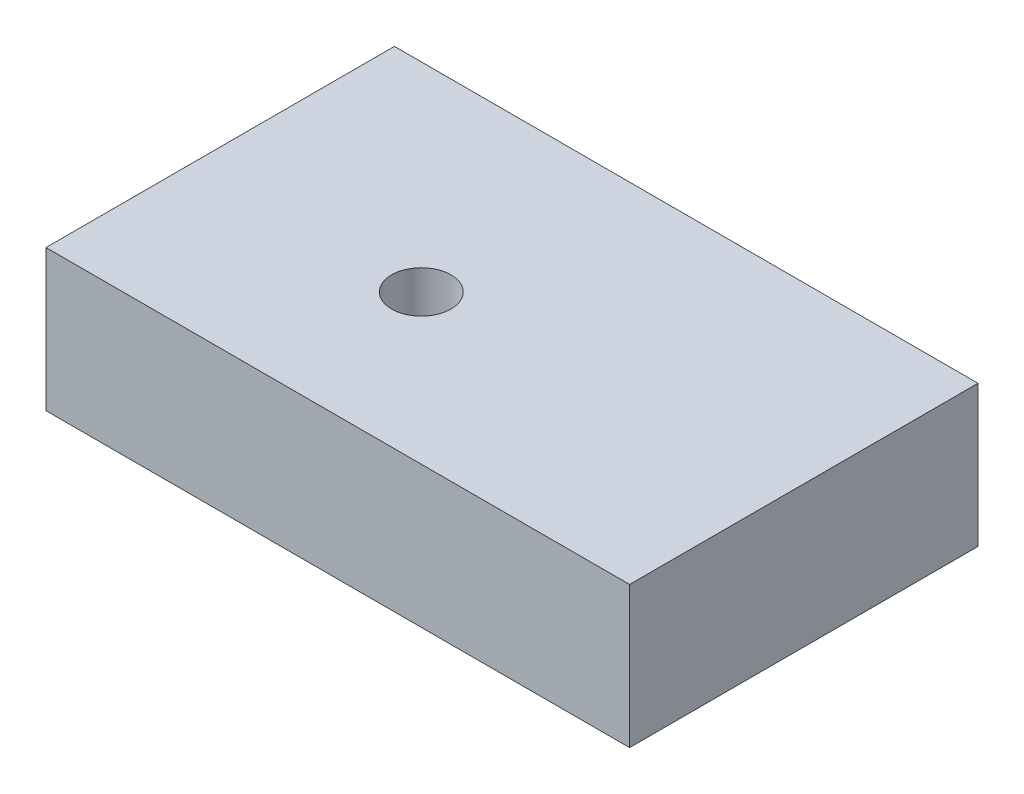
ISO-10303-21;
HEADER;
FILE_DESCRIPTION(('STEP AP214'),'2;1');
FILE_NAME('part.step','',(''),(''),'','','');
FILE_SCHEMA(('AUTOMOTIVE_DESIGN { 1 0 10303 214 1 1 1 1 }'));
ENDSEC;
DATA;
#1=APPLICATION_CONTEXT('core data for automotive mechanical design processes');
#2=APPLICATION_PROTOCOL_DEFINITION('international standard','automotive_design',2000,#1);
#3=PRODUCT_CONTEXT('',#1,'mechanical');
#4=PRODUCT('Part','Part','',(#3));
#5=PRODUCT_RELATED_PRODUCT_CATEGORY('part','',(#4));
#6=PRODUCT_DEFINITION_FORMATION('','',#4);
#7=PRODUCT_DEFINITION_CONTEXT('part definition',#1,'design');
#8=PRODUCT_DEFINITION('design','',#6,#7);
#9=PRODUCT_DEFINITION_SHAPE('','',#8);
#10=(LENGTH_UNIT() NAMED_UNIT(*) SI_UNIT(.MILLI.,.METRE.));
#11=(NAMED_UNIT(*) PLANE_ANGLE_UNIT() SI_UNIT($,.RADIAN.));
#12=(NAMED_UNIT(*) SI_UNIT($,.STERADIAN.) SOLID_ANGLE_UNIT());
#13=UNCERTAINTY_MEASURE_WITH_UNIT(LENGTH_MEASURE(1.E-05),#10,'distance_accuracy_value','');
#14=(GEOMETRIC_REPRESENTATION_CONTEXT(3) GLOBAL_UNCERTAINTY_ASSIGNED_CONTEXT((#13)) GLOBAL_UNIT_ASSIGNED_CONTEXT((#10,
#11,#12)) REPRESENTATION_CONTEXT('',''));
#15=CARTESIAN_POINT('',(0.,0.,0.));
#16=DIRECTION('',(0.,0.,1.));
#17=DIRECTION('',(1.,0.,0.));
#18=AXIS2_PLACEMENT_3D('',#15,#16,#17);
#19=CARTESIAN_POINT('',(-19.0441039925719,-10.,11.1257660167131));
#20=DIRECTION('',(-1.,0.,0.));
#21=DIRECTION('',(0.,0.,1.));
#22=AXIS2_PLACEMENT_3D('',#19,#20,#21);
#23=PLANE('',#22);
#24=DIRECTION('',(0.,0.,1.));
#25=VECTOR('',#24,1.);
#26=CARTESIAN_POINT('',(-19.0441039925719,0.,11.1257660167131));
#27=LINE('',#26,#25);
#28=CARTESIAN_POINT('',(-19.0441039925719,0.,-13.5313370473537));
#29=VERTEX_POINT('',#28);
#30=CARTESIAN_POINT('',(-19.0441039925719,0.,11.1257660167131));
#31=VERTEX_POINT('',#30);
#32=EDGE_CURVE('E100',#29,#31,#27,.T.);
#33=ORIENTED_EDGE('',*,*,#32,.F.);
#34=DIRECTION('',(0.,1.,0.));
#35=VECTOR('',#34,1.);
#36=CARTESIAN_POINT('',(-19.0441039925719,-10.,-13.5313370473537));
#37=LINE('',#36,#35);
#38=CARTESIAN_POINT('',(-19.0441039925719,-10.,-13.5313370473537));
#39=VERTEX_POINT('',#38);
#40=EDGE_CURVE('E11',#39,#29,#37,.T.);
#41=ORIENTED_EDGE('',*,*,#40,.F.);
#42=DIRECTION('',(0.,0.,1.));
#43=VECTOR('',#42,1.);
#44=CARTESIAN_POINT('',(-19.0441039925719,-10.,11.1257660167131));
#45=LINE('',#44,#43);
#46=CARTESIAN_POINT('',(-19.0441039925719,-10.,11.1257660167131));
#47=VERTEX_POINT('',#46);
#48=EDGE_CURVE('E93',#39,#47,#45,.T.);
#49=ORIENTED_EDGE('',*,*,#48,.T.);
#50=DIRECTION('',(0.,1.,0.));
#51=VECTOR('',#50,1.);
#52=CARTESIAN_POINT('',(-19.0441039925719,-10.,11.1257660167131));
#53=LINE('',#52,#51);
#54=EDGE_CURVE('E38',#47,#31,#53,.T.);
#55=ORIENTED_EDGE('',*,*,#54,.T.);
#56=EDGE_LOOP('',(#33,#41,#49,#55));
#57=FACE_BOUND('',#56,.T.);
#58=ADVANCED_FACE('F35',(#57),#23,.T.);
#59=CARTESIAN_POINT('',(-19.0441039925719,-10.,-13.5313370473537));
#60=DIRECTION('',(0.,0.,-1.));
#61=DIRECTION('',(-1.,0.,0.));
#62=AXIS2_PLACEMENT_3D('',#59,#60,#61);
#63=PLANE('',#62);
#64=DIRECTION('',(-1.,0.,0.));
#65=VECTOR('',#64,1.);
#66=CARTESIAN_POINT('',(-19.0441039925719,0.,-13.5313370473537));
#67=LINE('',#66,#65);
#68=CARTESIAN_POINT('',(22.2515320334262,0.,-13.5313370473537));
#69=VERTEX_POINT('',#68);
#70=EDGE_CURVE('E95',#69,#29,#67,.T.);
#71=ORIENTED_EDGE('',*,*,#70,.F.);
#72=DIRECTION('',(0.,1.,0.));
#73=VECTOR('',#72,1.);
#74=CARTESIAN_POINT('',(22.2515320334262,-10.,-13.5313370473537));
#75=LINE('',#74,#73);
#76=CARTESIAN_POINT('',(22.2515320334262,-10.,-13.5313370473537));
#77=VERTEX_POINT('',#76);
#78=EDGE_CURVE('E44',#77,#69,#75,.T.);
#79=ORIENTED_EDGE('',*,*,#78,.F.);
#80=DIRECTION('',(-1.,0.,0.));
#81=VECTOR('',#80,1.);
#82=CARTESIAN_POINT('',(-19.0441039925719,-10.,-13.5313370473537));
#83=LINE('',#82,#81);
#84=EDGE_CURVE('E90',#77,#39,#83,.T.);
#85=ORIENTED_EDGE('',*,*,#84,.T.);
#86=ORIENTED_EDGE('',*,*,#40,.T.);
#87=EDGE_LOOP('',(#71,#79,#85,#86));
#88=FACE_BOUND('',#87,.T.);
#89=ADVANCED_FACE('F111',(#88),#63,.T.);
#90=CARTESIAN_POINT('',(22.2515320334262,-10.,11.1257660167131));
#91=DIRECTION('',(1.,0.,0.));
#92=DIRECTION('',(0.,0.,-1.));
#93=AXIS2_PLACEMENT_3D('',#90,#91,#92);
#94=PLANE('',#93);
#95=DIRECTION('',(0.,0.,-1.));
#96=VECTOR('',#95,1.);
#97=CARTESIAN_POINT('',(22.2515320334262,0.,11.1257660167131));
#98=LINE('',#97,#96);
#99=CARTESIAN_POINT('',(22.2515320334262,0.,11.1257660167131));
#100=VERTEX_POINT('',#99);
#101=EDGE_CURVE('E85',#100,#69,#98,.T.);
#102=ORIENTED_EDGE('',*,*,#101,.F.);
#103=DIRECTION('',(0.,1.,0.));
#104=VECTOR('',#103,1.);
#105=CARTESIAN_POINT('',(22.2515320334262,-10.,11.1257660167131));
#106=LINE('',#105,#104);
#107=CARTESIAN_POINT('',(22.2515320334262,-10.,11.1257660167131));
#108=VERTEX_POINT('',#107);
#109=EDGE_CURVE('E80',#108,#100,#106,.T.);
#110=ORIENTED_EDGE('',*,*,#109,.F.);
#111=DIRECTION('',(0.,0.,-1.));
#112=VECTOR('',#111,1.);
#113=CARTESIAN_POINT('',(22.2515320334262,-10.,11.1257660167131));
#114=LINE('',#113,#112);
#115=EDGE_CURVE('E83',#108,#77,#114,.T.);
#116=ORIENTED_EDGE('',*,*,#115,.T.);
#117=ORIENTED_EDGE('',*,*,#78,.T.);
#118=EDGE_LOOP('',(#102,#110,#116,#117));
#119=FACE_BOUND('',#118,.T.);
#120=ADVANCED_FACE('F82',(#119),#94,.T.);
#121=CARTESIAN_POINT('',(-19.0441039925719,-10.,11.1257660167131));
#122=DIRECTION('',(0.,0.,1.));
#123=DIRECTION('',(1.,0.,0.));
#124=AXIS2_PLACEMENT_3D('',#121,#122,#123);
#125=PLANE('',#124);
#126=DIRECTION('',(1.,0.,0.));
#127=VECTOR('',#126,1.);
#128=CARTESIAN_POINT('',(-19.0441039925719,0.,11.1257660167131));
#129=LINE('',#128,#127);
#130=EDGE_CURVE('E103',#31,#100,#129,.T.);
#131=ORIENTED_EDGE('',*,*,#130,.F.);
#132=ORIENTED_EDGE('',*,*,#54,.F.);
#133=DIRECTION('',(1.,0.,0.));
#134=VECTOR('',#133,1.);
#135=CARTESIAN_POINT('',(-19.0441039925719,-10.,11.1257660167131));
#136=LINE('',#135,#134);
#137=EDGE_CURVE('E89',#47,#108,#136,.T.);
#138=ORIENTED_EDGE('',*,*,#137,.T.);
#139=ORIENTED_EDGE('',*,*,#109,.T.);
#140=EDGE_LOOP('',(#131,#132,#138,#139));
#141=FACE_BOUND('',#140,.T.);
#142=ADVANCED_FACE('F92',(#141),#125,.T.);
#143=CARTESIAN_POINT('',(-19.0441039925719,-10.,-13.5313370473537));
#144=DIRECTION('',(0.,-1.,0.));
#145=DIRECTION('',(0.,0.,-1.));
#146=AXIS2_PLACEMENT_3D('',#143,#144,#145);
#147=PLANE('',#146);
#148=CARTESIAN_POINT('',(-3.04403557379374,-10.,0.569159987207968));
#149=DIRECTION('',(0.,-1.,0.));
#150=DIRECTION('',(0.,0.,-1.));
#151=AXIS2_PLACEMENT_3D('',#148,#149,#150);
#152=CIRCLE('',#151,2.09999999999999);
#153=CARTESIAN_POINT('',(-3.04403557379374,-10.,-1.53084001279202));
#154=VERTEX_POINT('',#153);
#155=EDGE_CURVE('E104',#154,#154,#152,.T.);
#156=ORIENTED_EDGE('',*,*,#155,.F.);
#157=EDGE_LOOP('',(#156));
#158=FACE_BOUND('',#157,.T.);
#159=ORIENTED_EDGE('',*,*,#48,.F.);
#160=ORIENTED_EDGE('',*,*,#84,.F.);
#161=ORIENTED_EDGE('',*,*,#115,.F.);
#162=ORIENTED_EDGE('',*,*,#137,.F.);
#163=EDGE_LOOP('',(#159,#160,#161,#162));
#164=FACE_BOUND('',#163,.T.);
#165=ADVANCED_FACE('F88',(#158,#164),#147,.T.);
#166=CARTESIAN_POINT('',(-19.0441039925719,0.,-13.5313370473537));
#167=DIRECTION('',(0.,-1.,0.));
#168=DIRECTION('',(0.,0.,-1.));
#169=AXIS2_PLACEMENT_3D('',#166,#167,#168);
#170=PLANE('',#169);
#171=CARTESIAN_POINT('',(-3.04403557379374,0.,0.569159987207968));
#172=DIRECTION('',(0.,1.,0.));
#173=DIRECTION('',(0.,0.,1.));
#174=AXIS2_PLACEMENT_3D('',#171,#172,#173);
#175=CIRCLE('',#174,2.09999999999999);
#176=CARTESIAN_POINT('',(-3.04403557379374,0.,2.66915998720796));
#177=VERTEX_POINT('',#176);
#178=EDGE_CURVE('E141',#177,#177,#175,.T.);
#179=ORIENTED_EDGE('',*,*,#178,.F.);
#180=EDGE_LOOP('',(#179));
#181=FACE_BOUND('',#180,.T.);
#182=ORIENTED_EDGE('',*,*,#32,.T.);
#183=ORIENTED_EDGE('',*,*,#130,.T.);
#184=ORIENTED_EDGE('',*,*,#101,.T.);
#185=ORIENTED_EDGE('',*,*,#70,.T.);
#186=EDGE_LOOP('',(#182,#183,#184,#185));
#187=FACE_BOUND('',#186,.T.);
#188=ADVANCED_FACE('F110',(#181,#187),#170,.F.);
#189=CARTESIAN_POINT('',(-3.04403557379374,0.,0.569159987207968));
#190=DIRECTION('',(0.,1.,0.));
#191=DIRECTION('',(0.,0.,1.));
#192=AXIS2_PLACEMENT_3D('',#189,#190,#191);
#193=CYLINDRICAL_SURFACE('',#192,2.09999999999999);
#194=ORIENTED_EDGE('',*,*,#155,.T.);
#195=EDGE_LOOP('',(#194));
#196=FACE_BOUND('',#195,.T.);
#197=ORIENTED_EDGE('',*,*,#178,.T.);
#198=EDGE_LOOP('',(#197));
#199=FACE_BOUND('',#198,.T.);
#200=ADVANCED_FACE('F129',(#196,#199),#193,.F.);
#201=CLOSED_SHELL('',(#58,#89,#120,#142,#165,#188,#200));
#202=MANIFOLD_SOLID_BREP('B2',#201);
#203=ADVANCED_BREP_SHAPE_REPRESENTATION('',(#18,#202),#14);
#204=SHAPE_DEFINITION_REPRESENTATION(#9,#203);
ENDSEC;
END-ISO-10303-21;
